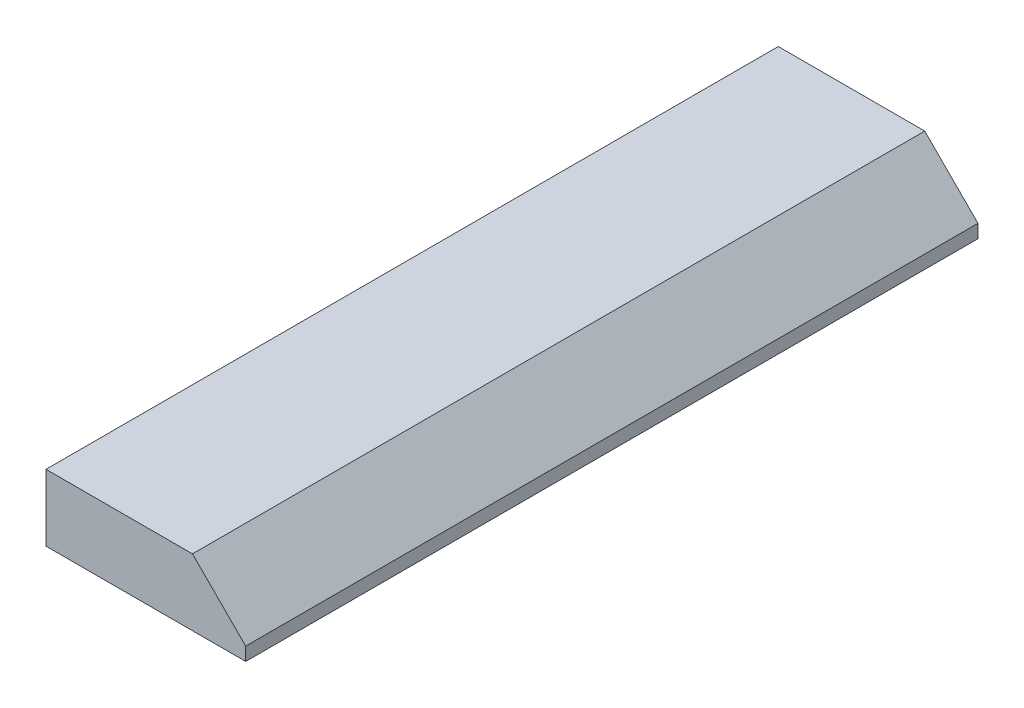
ISO-10303-21;
HEADER;
FILE_DESCRIPTION(('STEP AP214'),'2;1');
FILE_NAME('part.step','',(''),(''),'','','');
FILE_SCHEMA(('AUTOMOTIVE_DESIGN { 1 0 10303 214 1 1 1 1 }'));
ENDSEC;
DATA;
#1=APPLICATION_CONTEXT('core data for automotive mechanical design processes');
#2=APPLICATION_PROTOCOL_DEFINITION('international standard','automotive_design',2000,#1);
#3=PRODUCT_CONTEXT('',#1,'mechanical');
#4=PRODUCT('Part','Part','',(#3));
#5=PRODUCT_RELATED_PRODUCT_CATEGORY('part','',(#4));
#6=PRODUCT_DEFINITION_FORMATION('','',#4);
#7=PRODUCT_DEFINITION_CONTEXT('part definition',#1,'design');
#8=PRODUCT_DEFINITION('design','',#6,#7);
#9=PRODUCT_DEFINITION_SHAPE('','',#8);
#10=(LENGTH_UNIT() NAMED_UNIT(*) SI_UNIT(.MILLI.,.METRE.));
#11=(NAMED_UNIT(*) PLANE_ANGLE_UNIT() SI_UNIT($,.RADIAN.));
#12=(NAMED_UNIT(*) SI_UNIT($,.STERADIAN.) SOLID_ANGLE_UNIT());
#13=UNCERTAINTY_MEASURE_WITH_UNIT(LENGTH_MEASURE(1.E-05),#10,'distance_accuracy_value','');
#14=(GEOMETRIC_REPRESENTATION_CONTEXT(3) GLOBAL_UNCERTAINTY_ASSIGNED_CONTEXT((#13)) GLOBAL_UNIT_ASSIGNED_CONTEXT((#10,
#11,#12)) REPRESENTATION_CONTEXT('',''));
#15=CARTESIAN_POINT('',(0.,0.,0.));
#16=DIRECTION('',(0.,0.,1.));
#17=DIRECTION('',(1.,0.,0.));
#18=AXIS2_PLACEMENT_3D('',#15,#16,#17);
#19=CARTESIAN_POINT('',(0.,0.,69.85));
#20=DIRECTION('',(1.,0.,0.));
#21=DIRECTION('',(0.,0.,-1.));
#22=AXIS2_PLACEMENT_3D('',#19,#20,#21);
#23=PLANE('',#22);
#24=DIRECTION('',(0.,-1.,0.));
#25=VECTOR('',#24,1.);
#26=CARTESIAN_POINT('',(0.,0.,0.));
#27=LINE('',#26,#25);
#28=CARTESIAN_POINT('',(0.,6.34999999999999,0.));
#29=VERTEX_POINT('',#28);
#30=CARTESIAN_POINT('',(0.,0.,0.));
#31=VERTEX_POINT('',#30);
#32=EDGE_CURVE('E128',#29,#31,#27,.T.);
#33=ORIENTED_EDGE('',*,*,#32,.T.);
#34=DIRECTION('',(0.,0.,-1.));
#35=VECTOR('',#34,1.);
#36=CARTESIAN_POINT('',(0.,0.,69.85));
#37=LINE('',#36,#35);
#38=CARTESIAN_POINT('',(0.,0.,69.85));
#39=VERTEX_POINT('',#38);
#40=EDGE_CURVE('E11',#39,#31,#37,.T.);
#41=ORIENTED_EDGE('',*,*,#40,.F.);
#42=DIRECTION('',(0.,-1.,0.));
#43=VECTOR('',#42,1.);
#44=CARTESIAN_POINT('',(0.,0.,69.85));
#45=LINE('',#44,#43);
#46=CARTESIAN_POINT('',(0.,6.34999999999999,69.85));
#47=VERTEX_POINT('',#46);
#48=EDGE_CURVE('E141',#47,#39,#45,.T.);
#49=ORIENTED_EDGE('',*,*,#48,.F.);
#50=DIRECTION('',(0.,0.,-1.));
#51=VECTOR('',#50,1.);
#52=CARTESIAN_POINT('',(0.,6.34999999999999,69.85));
#53=LINE('',#52,#51);
#54=EDGE_CURVE('E124',#47,#29,#53,.T.);
#55=ORIENTED_EDGE('',*,*,#54,.T.);
#56=EDGE_LOOP('',(#33,#41,#49,#55));
#57=FACE_BOUND('',#56,.T.);
#58=ADVANCED_FACE('F39',(#57),#23,.F.);
#59=CARTESIAN_POINT('',(0.,0.,69.85));
#60=DIRECTION('',(0.,1.,0.));
#61=DIRECTION('',(0.,0.,1.));
#62=AXIS2_PLACEMENT_3D('',#59,#60,#61);
#63=PLANE('',#62);
#64=DIRECTION('',(1.,0.,0.));
#65=VECTOR('',#64,1.);
#66=CARTESIAN_POINT('',(0.,0.,0.));
#67=LINE('',#66,#65);
#68=CARTESIAN_POINT('',(19.05,0.,0.));
#69=VERTEX_POINT('',#68);
#70=EDGE_CURVE('E132',#31,#69,#67,.T.);
#71=ORIENTED_EDGE('',*,*,#70,.T.);
#72=DIRECTION('',(0.,0.,-1.));
#73=VECTOR('',#72,1.);
#74=CARTESIAN_POINT('',(19.05,0.,69.85));
#75=LINE('',#74,#73);
#76=CARTESIAN_POINT('',(19.05,0.,69.85));
#77=VERTEX_POINT('',#76);
#78=EDGE_CURVE('E48',#77,#69,#75,.T.);
#79=ORIENTED_EDGE('',*,*,#78,.F.);
#80=DIRECTION('',(1.,0.,0.));
#81=VECTOR('',#80,1.);
#82=CARTESIAN_POINT('',(0.,0.,69.85));
#83=LINE('',#82,#81);
#84=EDGE_CURVE('E99',#39,#77,#83,.T.);
#85=ORIENTED_EDGE('',*,*,#84,.F.);
#86=ORIENTED_EDGE('',*,*,#40,.T.);
#87=EDGE_LOOP('',(#71,#79,#85,#86));
#88=FACE_BOUND('',#87,.T.);
#89=ADVANCED_FACE('F163',(#88),#63,.F.);
#90=CARTESIAN_POINT('',(19.05,1.27000000000005,69.85));
#91=DIRECTION('',(-1.,0.,0.));
#92=DIRECTION('',(0.,0.,1.));
#93=AXIS2_PLACEMENT_3D('',#90,#91,#92);
#94=PLANE('',#93);
#95=DIRECTION('',(0.,1.,0.));
#96=VECTOR('',#95,1.);
#97=CARTESIAN_POINT('',(19.05,1.27000000000005,0.));
#98=LINE('',#97,#96);
#99=CARTESIAN_POINT('',(19.05,1.27000000000005,0.));
#100=VERTEX_POINT('',#99);
#101=EDGE_CURVE('E116',#69,#100,#98,.T.);
#102=ORIENTED_EDGE('',*,*,#101,.T.);
#103=DIRECTION('',(0.,0.,-1.));
#104=VECTOR('',#103,1.);
#105=CARTESIAN_POINT('',(19.05,1.27000000000005,69.85));
#106=LINE('',#105,#104);
#107=CARTESIAN_POINT('',(19.05,1.27000000000005,69.85));
#108=VERTEX_POINT('',#107);
#109=EDGE_CURVE('E113',#108,#100,#106,.T.);
#110=ORIENTED_EDGE('',*,*,#109,.F.);
#111=DIRECTION('',(0.,1.,0.));
#112=VECTOR('',#111,1.);
#113=CARTESIAN_POINT('',(19.05,1.27000000000005,69.85));
#114=LINE('',#113,#112);
#115=EDGE_CURVE('E104',#77,#108,#114,.T.);
#116=ORIENTED_EDGE('',*,*,#115,.F.);
#117=ORIENTED_EDGE('',*,*,#78,.T.);
#118=EDGE_LOOP('',(#102,#110,#116,#117));
#119=FACE_BOUND('',#118,.T.);
#120=ADVANCED_FACE('F114',(#119),#94,.F.);
#121=CARTESIAN_POINT('',(19.05,1.27000000000005,69.85));
#122=DIRECTION('',(-0.707106781186544,-0.707106781186551,0.));
#123=DIRECTION('',(0.707106781186551,-0.707106781186544,0.));
#124=AXIS2_PLACEMENT_3D('',#121,#122,#123);
#125=PLANE('',#124);
#126=DIRECTION('',(-0.707106781186551,0.707106781186544,0.));
#127=VECTOR('',#126,1.);
#128=CARTESIAN_POINT('',(19.05,1.27000000000005,0.));
#129=LINE('',#128,#127);
#130=CARTESIAN_POINT('',(13.97,6.35,0.));
#131=VERTEX_POINT('',#130);
#132=EDGE_CURVE('E83',#100,#131,#129,.T.);
#133=ORIENTED_EDGE('',*,*,#132,.T.);
#134=DIRECTION('',(0.,0.,-1.));
#135=VECTOR('',#134,1.);
#136=CARTESIAN_POINT('',(13.97,6.35,69.85));
#137=LINE('',#136,#135);
#138=CARTESIAN_POINT('',(13.97,6.35,69.85));
#139=VERTEX_POINT('',#138);
#140=EDGE_CURVE('E118',#139,#131,#137,.T.);
#141=ORIENTED_EDGE('',*,*,#140,.F.);
#142=DIRECTION('',(-0.707106781186551,0.707106781186544,0.));
#143=VECTOR('',#142,1.);
#144=CARTESIAN_POINT('',(19.05,1.27000000000005,69.85));
#145=LINE('',#144,#143);
#146=EDGE_CURVE('E108',#108,#139,#145,.T.);
#147=ORIENTED_EDGE('',*,*,#146,.F.);
#148=ORIENTED_EDGE('',*,*,#109,.T.);
#149=EDGE_LOOP('',(#133,#141,#147,#148));
#150=FACE_BOUND('',#149,.T.);
#151=ADVANCED_FACE('F120',(#150),#125,.F.);
#152=CARTESIAN_POINT('',(0.,6.34999999999999,69.85));
#153=DIRECTION('',(0.,-1.,0.));
#154=DIRECTION('',(1.,0.,0.));
#155=AXIS2_PLACEMENT_3D('',#152,#153,#154);
#156=PLANE('',#155);
#157=DIRECTION('',(-1.,0.,0.));
#158=VECTOR('',#157,1.);
#159=CARTESIAN_POINT('',(0.,6.34999999999999,0.));
#160=LINE('',#159,#158);
#161=EDGE_CURVE('E91',#131,#29,#160,.T.);
#162=ORIENTED_EDGE('',*,*,#161,.T.);
#163=ORIENTED_EDGE('',*,*,#54,.F.);
#164=DIRECTION('',(-1.,0.,0.));
#165=VECTOR('',#164,1.);
#166=CARTESIAN_POINT('',(0.,6.34999999999999,69.85));
#167=LINE('',#166,#165);
#168=EDGE_CURVE('E59',#139,#47,#167,.T.);
#169=ORIENTED_EDGE('',*,*,#168,.F.);
#170=ORIENTED_EDGE('',*,*,#140,.T.);
#171=EDGE_LOOP('',(#162,#163,#169,#170));
#172=FACE_BOUND('',#171,.T.);
#173=ADVANCED_FACE('F152',(#172),#156,.F.);
#174=CARTESIAN_POINT('',(0.,0.,69.85));
#175=DIRECTION('',(0.,0.,-1.));
#176=DIRECTION('',(-1.,0.,0.));
#177=AXIS2_PLACEMENT_3D('',#174,#175,#176);
#178=PLANE('',#177);
#179=ORIENTED_EDGE('',*,*,#48,.T.);
#180=ORIENTED_EDGE('',*,*,#84,.T.);
#181=ORIENTED_EDGE('',*,*,#115,.T.);
#182=ORIENTED_EDGE('',*,*,#146,.T.);
#183=ORIENTED_EDGE('',*,*,#168,.T.);
#184=EDGE_LOOP('',(#179,#180,#181,#182,#183));
#185=FACE_BOUND('',#184,.T.);
#186=ADVANCED_FACE('F106',(#185),#178,.F.);
#187=CARTESIAN_POINT('',(0.,0.,0.));
#188=DIRECTION('',(0.,0.,-1.));
#189=DIRECTION('',(-1.,0.,0.));
#190=AXIS2_PLACEMENT_3D('',#187,#188,#189);
#191=PLANE('',#190);
#192=ORIENTED_EDGE('',*,*,#32,.F.);
#193=ORIENTED_EDGE('',*,*,#161,.F.);
#194=ORIENTED_EDGE('',*,*,#132,.F.);
#195=ORIENTED_EDGE('',*,*,#101,.F.);
#196=ORIENTED_EDGE('',*,*,#70,.F.);
#197=EDGE_LOOP('',(#192,#193,#194,#195,#196));
#198=FACE_BOUND('',#197,.T.);
#199=ADVANCED_FACE('F148',(#198),#191,.T.);
#200=CLOSED_SHELL('',(#58,#89,#120,#151,#173,#186,#199));
#201=MANIFOLD_SOLID_BREP('B2',#200);
#202=ADVANCED_BREP_SHAPE_REPRESENTATION('',(#18,#201),#14);
#203=SHAPE_DEFINITION_REPRESENTATION(#9,#202);
ENDSEC;
END-ISO-10303-21;
